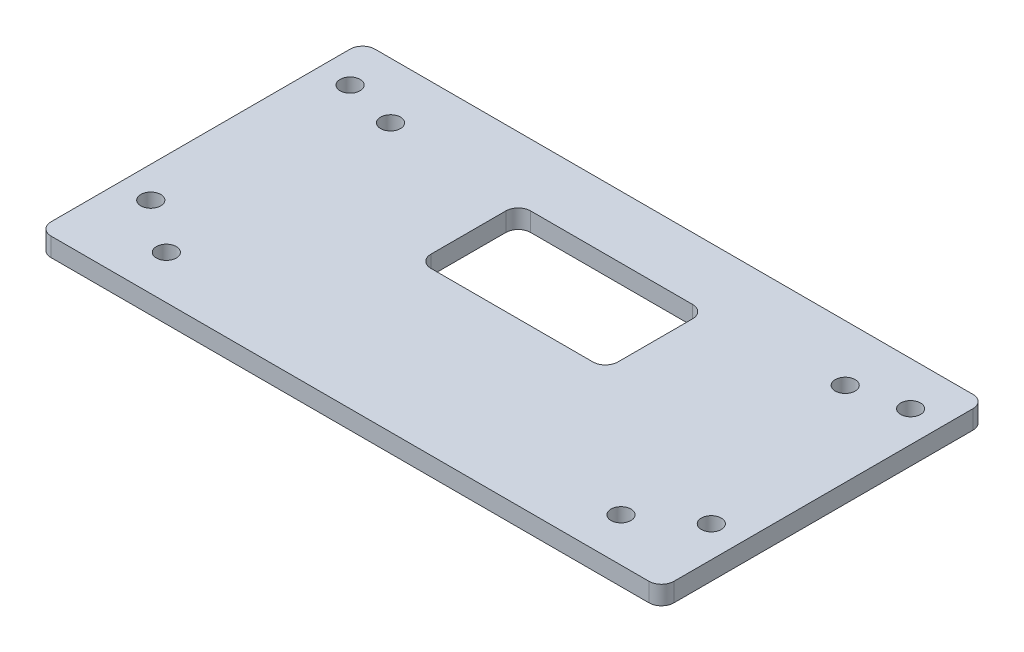
ISO-10303-21;
HEADER;
FILE_DESCRIPTION(('STEP AP214'),'2;1');
FILE_NAME('part.step','',(''),(''),'','','');
FILE_SCHEMA(('AUTOMOTIVE_DESIGN { 1 0 10303 214 1 1 1 1 }'));
ENDSEC;
DATA;
#1=APPLICATION_CONTEXT('core data for automotive mechanical design processes');
#2=APPLICATION_PROTOCOL_DEFINITION('international standard','automotive_design',2000,#1);
#3=PRODUCT_CONTEXT('',#1,'mechanical');
#4=PRODUCT('Part','Part','',(#3));
#5=PRODUCT_RELATED_PRODUCT_CATEGORY('part','',(#4));
#6=PRODUCT_DEFINITION_FORMATION('','',#4);
#7=PRODUCT_DEFINITION_CONTEXT('part definition',#1,'design');
#8=PRODUCT_DEFINITION('design','',#6,#7);
#9=PRODUCT_DEFINITION_SHAPE('','',#8);
#10=(LENGTH_UNIT() NAMED_UNIT(*) SI_UNIT(.MILLI.,.METRE.));
#11=(NAMED_UNIT(*) PLANE_ANGLE_UNIT() SI_UNIT($,.RADIAN.));
#12=(NAMED_UNIT(*) SI_UNIT($,.STERADIAN.) SOLID_ANGLE_UNIT());
#13=UNCERTAINTY_MEASURE_WITH_UNIT(LENGTH_MEASURE(1.E-05),#10,'distance_accuracy_value','');
#14=(GEOMETRIC_REPRESENTATION_CONTEXT(3) GLOBAL_UNCERTAINTY_ASSIGNED_CONTEXT((#13)) GLOBAL_UNIT_ASSIGNED_CONTEXT((#10,
#11,#12)) REPRESENTATION_CONTEXT('',''));
#15=CARTESIAN_POINT('',(0.,0.,0.));
#16=DIRECTION('',(0.,0.,1.));
#17=DIRECTION('',(1.,0.,0.));
#18=AXIS2_PLACEMENT_3D('',#15,#16,#17);
#19=CARTESIAN_POINT('',(0.,3.,0.));
#20=DIRECTION('',(0.,-1.,0.));
#21=DIRECTION('',(0.,0.,-1.));
#22=AXIS2_PLACEMENT_3D('',#19,#20,#21);
#23=PLANE('',#22);
#24=CARTESIAN_POINT('',(45.,3.,-19.));
#25=DIRECTION('',(0.,1.,0.));
#26=DIRECTION('',(0.,0.,-1.));
#27=AXIS2_PLACEMENT_3D('',#24,#25,#26);
#28=CIRCLE('',#27,1.6);
#29=CARTESIAN_POINT('',(45.,3.,-20.6));
#30=VERTEX_POINT('',#29);
#31=EDGE_CURVE('E222',#30,#30,#28,.T.);
#32=ORIENTED_EDGE('',*,*,#31,.F.);
#33=EDGE_LOOP('',(#32));
#34=FACE_BOUND('',#33,.T.);
#35=CARTESIAN_POINT('',(-44.9999999999997,3.,13.));
#36=DIRECTION('',(0.,1.,0.));
#37=DIRECTION('',(0.,0.,1.));
#38=AXIS2_PLACEMENT_3D('',#35,#36,#37);
#39=CIRCLE('',#38,1.6);
#40=CARTESIAN_POINT('',(-44.9999999999997,3.,14.6));
#41=VERTEX_POINT('',#40);
#42=EDGE_CURVE('E228',#41,#41,#39,.T.);
#43=ORIENTED_EDGE('',*,*,#42,.F.);
#44=EDGE_LOOP('',(#43));
#45=FACE_BOUND('',#44,.T.);
#46=CARTESIAN_POINT('',(-36.4999999999991,3.,19.));
#47=DIRECTION('',(0.,1.,0.));
#48=DIRECTION('',(0.,0.,1.));
#49=AXIS2_PLACEMENT_3D('',#46,#47,#48);
#50=CIRCLE('',#49,1.6);
#51=CARTESIAN_POINT('',(-36.4999999999991,3.,20.6));
#52=VERTEX_POINT('',#51);
#53=EDGE_CURVE('E234',#52,#52,#50,.T.);
#54=ORIENTED_EDGE('',*,*,#53,.F.);
#55=EDGE_LOOP('',(#54));
#56=FACE_BOUND('',#55,.T.);
#57=CARTESIAN_POINT('',(36.5000000000009,3.,19.));
#58=DIRECTION('',(0.,1.,0.));
#59=DIRECTION('',(0.,0.,1.));
#60=AXIS2_PLACEMENT_3D('',#57,#58,#59);
#61=CIRCLE('',#60,1.6);
#62=CARTESIAN_POINT('',(36.5000000000009,3.,20.6));
#63=VERTEX_POINT('',#62);
#64=EDGE_CURVE('E240',#63,#63,#61,.T.);
#65=ORIENTED_EDGE('',*,*,#64,.F.);
#66=EDGE_LOOP('',(#65));
#67=FACE_BOUND('',#66,.T.);
#68=CARTESIAN_POINT('',(36.5,3.,-17.));
#69=DIRECTION('',(0.,1.,0.));
#70=DIRECTION('',(0.,0.,1.));
#71=AXIS2_PLACEMENT_3D('',#68,#69,#70);
#72=CIRCLE('',#71,1.6);
#73=CARTESIAN_POINT('',(36.5,3.,-15.4));
#74=VERTEX_POINT('',#73);
#75=EDGE_CURVE('E246',#74,#74,#72,.T.);
#76=ORIENTED_EDGE('',*,*,#75,.F.);
#77=EDGE_LOOP('',(#76));
#78=FACE_BOUND('',#77,.T.);
#79=CARTESIAN_POINT('',(-45.,3.,-19.));
#80=DIRECTION('',(0.,1.,0.));
#81=DIRECTION('',(0.,0.,1.));
#82=AXIS2_PLACEMENT_3D('',#79,#80,#81);
#83=CIRCLE('',#82,1.6);
#84=CARTESIAN_POINT('',(-45.,3.,-17.4));
#85=VERTEX_POINT('',#84);
#86=EDGE_CURVE('E252',#85,#85,#83,.T.);
#87=ORIENTED_EDGE('',*,*,#86,.F.);
#88=EDGE_LOOP('',(#87));
#89=FACE_BOUND('',#88,.T.);
#90=CARTESIAN_POINT('',(-36.5,3.,-17.));
#91=DIRECTION('',(0.,1.,0.));
#92=DIRECTION('',(0.,0.,1.));
#93=AXIS2_PLACEMENT_3D('',#90,#91,#92);
#94=CIRCLE('',#93,1.6);
#95=CARTESIAN_POINT('',(-36.5,3.,-15.4));
#96=VERTEX_POINT('',#95);
#97=EDGE_CURVE('E258',#96,#96,#94,.T.);
#98=ORIENTED_EDGE('',*,*,#97,.F.);
#99=EDGE_LOOP('',(#98));
#100=FACE_BOUND('',#99,.T.);
#101=DIRECTION('',(0.,0.,-1.));
#102=VECTOR('',#101,1.);
#103=CARTESIAN_POINT('',(50.,3.,26.));
#104=LINE('',#103,#102);
#105=CARTESIAN_POINT('',(50.,3.,24.));
#106=VERTEX_POINT('',#105);
#107=CARTESIAN_POINT('',(50.,3.,-24.));
#108=VERTEX_POINT('',#107);
#109=EDGE_CURVE('E264',#106,#108,#104,.T.);
#110=ORIENTED_EDGE('',*,*,#109,.T.);
#111=CARTESIAN_POINT('',(48.,3.,-24.));
#112=DIRECTION('',(0.,-1.,0.));
#113=DIRECTION('',(0.,0.,-1.));
#114=AXIS2_PLACEMENT_3D('',#111,#112,#113);
#115=CIRCLE('',#114,2.);
#116=CARTESIAN_POINT('',(48.,3.,-26.));
#117=VERTEX_POINT('',#116);
#118=EDGE_CURVE('E307',#108,#117,#115,.F.);
#119=ORIENTED_EDGE('',*,*,#118,.T.);
#120=DIRECTION('',(-1.,0.,0.));
#121=VECTOR('',#120,1.);
#122=CARTESIAN_POINT('',(-50.,3.,-26.));
#123=LINE('',#122,#121);
#124=CARTESIAN_POINT('',(-48.,3.,-26.));
#125=VERTEX_POINT('',#124);
#126=EDGE_CURVE('E267',#117,#125,#123,.T.);
#127=ORIENTED_EDGE('',*,*,#126,.T.);
#128=CARTESIAN_POINT('',(-48.,3.,-24.));
#129=DIRECTION('',(0.,-1.,0.));
#130=DIRECTION('',(0.,0.,-1.));
#131=AXIS2_PLACEMENT_3D('',#128,#129,#130);
#132=CIRCLE('',#131,2.);
#133=CARTESIAN_POINT('',(-50.,3.,-24.));
#134=VERTEX_POINT('',#133);
#135=EDGE_CURVE('E302',#125,#134,#132,.F.);
#136=ORIENTED_EDGE('',*,*,#135,.T.);
#137=DIRECTION('',(0.,0.,1.));
#138=VECTOR('',#137,1.);
#139=CARTESIAN_POINT('',(-50.,3.,26.));
#140=LINE('',#139,#138);
#141=CARTESIAN_POINT('',(-50.,3.,24.));
#142=VERTEX_POINT('',#141);
#143=EDGE_CURVE('E271',#134,#142,#140,.T.);
#144=ORIENTED_EDGE('',*,*,#143,.T.);
#145=CARTESIAN_POINT('',(-48.,3.,24.));
#146=DIRECTION('',(0.,-1.,0.));
#147=DIRECTION('',(0.,0.,-1.));
#148=AXIS2_PLACEMENT_3D('',#145,#146,#147);
#149=CIRCLE('',#148,2.);
#150=CARTESIAN_POINT('',(-48.,3.,26.));
#151=VERTEX_POINT('',#150);
#152=EDGE_CURVE('E56',#142,#151,#149,.F.);
#153=ORIENTED_EDGE('',*,*,#152,.T.);
#154=DIRECTION('',(1.,0.,0.));
#155=VECTOR('',#154,1.);
#156=CARTESIAN_POINT('',(-50.,3.,26.));
#157=LINE('',#156,#155);
#158=CARTESIAN_POINT('',(48.,3.,26.));
#159=VERTEX_POINT('',#158);
#160=EDGE_CURVE('E273',#151,#159,#157,.T.);
#161=ORIENTED_EDGE('',*,*,#160,.T.);
#162=CARTESIAN_POINT('',(48.,3.,24.));
#163=DIRECTION('',(0.,-1.,0.));
#164=DIRECTION('',(0.,0.,-1.));
#165=AXIS2_PLACEMENT_3D('',#162,#163,#164);
#166=CIRCLE('',#165,2.);
#167=EDGE_CURVE('E305',#159,#106,#166,.F.);
#168=ORIENTED_EDGE('',*,*,#167,.T.);
#169=EDGE_LOOP('',(#110,#119,#127,#136,#144,#153,#161,#168));
#170=FACE_BOUND('',#169,.T.);
#171=CARTESIAN_POINT('',(13.,3.,-2.));
#172=DIRECTION('',(0.,1.,0.));
#173=DIRECTION('',(0.,0.,1.));
#174=AXIS2_PLACEMENT_3D('',#171,#172,#173);
#175=CIRCLE('',#174,2.);
#176=CARTESIAN_POINT('',(13.,3.,0.));
#177=VERTEX_POINT('',#176);
#178=CARTESIAN_POINT('',(15.,3.,-2.));
#179=VERTEX_POINT('',#178);
#180=EDGE_CURVE('E149',#177,#179,#175,.T.);
#181=ORIENTED_EDGE('',*,*,#180,.F.);
#182=DIRECTION('',(1.,0.,0.));
#183=VECTOR('',#182,1.);
#184=CARTESIAN_POINT('',(-13.,3.,0.));
#185=LINE('',#184,#183);
#186=CARTESIAN_POINT('',(-13.,3.,0.));
#187=VERTEX_POINT('',#186);
#188=EDGE_CURVE('E187',#187,#177,#185,.T.);
#189=ORIENTED_EDGE('',*,*,#188,.F.);
#190=CARTESIAN_POINT('',(-13.,3.,-2.));
#191=DIRECTION('',(0.,1.,0.));
#192=DIRECTION('',(0.,0.,-1.));
#193=AXIS2_PLACEMENT_3D('',#190,#191,#192);
#194=CIRCLE('',#193,2.);
#195=CARTESIAN_POINT('',(-15.,3.,-2.));
#196=VERTEX_POINT('',#195);
#197=EDGE_CURVE('E184',#196,#187,#194,.T.);
#198=ORIENTED_EDGE('',*,*,#197,.F.);
#199=DIRECTION('',(0.,0.,1.));
#200=VECTOR('',#199,1.);
#201=CARTESIAN_POINT('',(-15.,3.,-2.));
#202=LINE('',#201,#200);
#203=CARTESIAN_POINT('',(-15.,3.,-14.));
#204=VERTEX_POINT('',#203);
#205=EDGE_CURVE('E182',#204,#196,#202,.T.);
#206=ORIENTED_EDGE('',*,*,#205,.F.);
#207=CARTESIAN_POINT('',(-13.,3.,-14.));
#208=DIRECTION('',(0.,1.,0.));
#209=DIRECTION('',(0.,0.,-1.));
#210=AXIS2_PLACEMENT_3D('',#207,#208,#209);
#211=CIRCLE('',#210,2.);
#212=CARTESIAN_POINT('',(-13.,3.,-16.));
#213=VERTEX_POINT('',#212);
#214=EDGE_CURVE('E180',#213,#204,#211,.T.);
#215=ORIENTED_EDGE('',*,*,#214,.F.);
#216=DIRECTION('',(-1.,0.,0.));
#217=VECTOR('',#216,1.);
#218=CARTESIAN_POINT('',(-13.,3.,-16.));
#219=LINE('',#218,#217);
#220=CARTESIAN_POINT('',(13.,3.,-16.));
#221=VERTEX_POINT('',#220);
#222=EDGE_CURVE('E175',#221,#213,#219,.T.);
#223=ORIENTED_EDGE('',*,*,#222,.F.);
#224=CARTESIAN_POINT('',(13.,3.,-14.));
#225=DIRECTION('',(0.,1.,0.));
#226=DIRECTION('',(0.,0.,-1.));
#227=AXIS2_PLACEMENT_3D('',#224,#225,#226);
#228=CIRCLE('',#227,2.);
#229=CARTESIAN_POINT('',(15.,3.,-14.));
#230=VERTEX_POINT('',#229);
#231=EDGE_CURVE('E173',#230,#221,#228,.T.);
#232=ORIENTED_EDGE('',*,*,#231,.F.);
#233=DIRECTION('',(0.,0.,-1.));
#234=VECTOR('',#233,1.);
#235=CARTESIAN_POINT('',(15.,3.,-2.));
#236=LINE('',#235,#234);
#237=EDGE_CURVE('E159',#179,#230,#236,.T.);
#238=ORIENTED_EDGE('',*,*,#237,.F.);
#239=EDGE_LOOP('',(#181,#189,#198,#206,#215,#223,#232,#238));
#240=FACE_BOUND('',#239,.T.);
#241=CARTESIAN_POINT('',(45.0000000000003,3.,13.));
#242=DIRECTION('',(0.,1.,0.));
#243=DIRECTION('',(0.,0.,-1.));
#244=AXIS2_PLACEMENT_3D('',#241,#242,#243);
#245=CIRCLE('',#244,1.6);
#246=CARTESIAN_POINT('',(45.0000000000003,3.,11.4));
#247=VERTEX_POINT('',#246);
#248=EDGE_CURVE('E191',#247,#247,#245,.T.);
#249=ORIENTED_EDGE('',*,*,#248,.F.);
#250=EDGE_LOOP('',(#249));
#251=FACE_BOUND('',#250,.T.);
#252=ADVANCED_FACE('F34',(#34,#45,#56,#67,#78,#89,#100,#170,#240,#251),#23,.F.);
#253=CARTESIAN_POINT('',(0.,0.,0.));
#254=DIRECTION('',(0.,-1.,0.));
#255=DIRECTION('',(0.,0.,-1.));
#256=AXIS2_PLACEMENT_3D('',#253,#254,#255);
#257=PLANE('',#256);
#258=DIRECTION('',(1.,0.,0.));
#259=VECTOR('',#258,1.);
#260=CARTESIAN_POINT('',(-13.,0.,0.));
#261=LINE('',#260,#259);
#262=CARTESIAN_POINT('',(-13.,0.,0.));
#263=VERTEX_POINT('',#262);
#264=CARTESIAN_POINT('',(13.,0.,0.));
#265=VERTEX_POINT('',#264);
#266=EDGE_CURVE('E160',#263,#265,#261,.T.);
#267=ORIENTED_EDGE('',*,*,#266,.T.);
#268=CARTESIAN_POINT('',(13.,0.,-2.));
#269=DIRECTION('',(0.,1.,0.));
#270=DIRECTION('',(0.,0.,1.));
#271=AXIS2_PLACEMENT_3D('',#268,#269,#270);
#272=CIRCLE('',#271,2.);
#273=CARTESIAN_POINT('',(15.,0.,-2.));
#274=VERTEX_POINT('',#273);
#275=EDGE_CURVE('E189',#265,#274,#272,.T.);
#276=ORIENTED_EDGE('',*,*,#275,.T.);
#277=DIRECTION('',(0.,0.,-1.));
#278=VECTOR('',#277,1.);
#279=CARTESIAN_POINT('',(15.,0.,-2.));
#280=LINE('',#279,#278);
#281=CARTESIAN_POINT('',(15.,0.,-14.));
#282=VERTEX_POINT('',#281);
#283=EDGE_CURVE('E166',#274,#282,#280,.T.);
#284=ORIENTED_EDGE('',*,*,#283,.T.);
#285=CARTESIAN_POINT('',(13.,0.,-14.));
#286=DIRECTION('',(0.,1.,0.));
#287=DIRECTION('',(0.,0.,-1.));
#288=AXIS2_PLACEMENT_3D('',#285,#286,#287);
#289=CIRCLE('',#288,2.);
#290=CARTESIAN_POINT('',(13.,0.,-16.));
#291=VERTEX_POINT('',#290);
#292=EDGE_CURVE('E193',#282,#291,#289,.T.);
#293=ORIENTED_EDGE('',*,*,#292,.T.);
#294=DIRECTION('',(-1.,0.,0.));
#295=VECTOR('',#294,1.);
#296=CARTESIAN_POINT('',(-13.,0.,-16.));
#297=LINE('',#296,#295);
#298=CARTESIAN_POINT('',(-13.,0.,-16.));
#299=VERTEX_POINT('',#298);
#300=EDGE_CURVE('E196',#291,#299,#297,.T.);
#301=ORIENTED_EDGE('',*,*,#300,.T.);
#302=CARTESIAN_POINT('',(-13.,0.,-14.));
#303=DIRECTION('',(0.,1.,0.));
#304=DIRECTION('',(0.,0.,-1.));
#305=AXIS2_PLACEMENT_3D('',#302,#303,#304);
#306=CIRCLE('',#305,2.);
#307=CARTESIAN_POINT('',(-15.,0.,-14.));
#308=VERTEX_POINT('',#307);
#309=EDGE_CURVE('E199',#299,#308,#306,.T.);
#310=ORIENTED_EDGE('',*,*,#309,.T.);
#311=DIRECTION('',(0.,0.,1.));
#312=VECTOR('',#311,1.);
#313=CARTESIAN_POINT('',(-15.,0.,-2.));
#314=LINE('',#313,#312);
#315=CARTESIAN_POINT('',(-15.,0.,-2.));
#316=VERTEX_POINT('',#315);
#317=EDGE_CURVE('E202',#308,#316,#314,.T.);
#318=ORIENTED_EDGE('',*,*,#317,.T.);
#319=CARTESIAN_POINT('',(-13.,0.,-2.));
#320=DIRECTION('',(0.,1.,0.));
#321=DIRECTION('',(0.,0.,-1.));
#322=AXIS2_PLACEMENT_3D('',#319,#320,#321);
#323=CIRCLE('',#322,2.);
#324=EDGE_CURVE('E205',#316,#263,#323,.T.);
#325=ORIENTED_EDGE('',*,*,#324,.T.);
#326=EDGE_LOOP('',(#267,#276,#284,#293,#301,#310,#318,#325));
#327=FACE_BOUND('',#326,.T.);
#328=CARTESIAN_POINT('',(45.,0.,-19.));
#329=DIRECTION('',(0.,1.,0.));
#330=DIRECTION('',(0.,0.,-1.));
#331=AXIS2_PLACEMENT_3D('',#328,#329,#330);
#332=CIRCLE('',#331,1.6);
#333=CARTESIAN_POINT('',(45.,0.,-20.6));
#334=VERTEX_POINT('',#333);
#335=EDGE_CURVE('E167',#334,#334,#332,.T.);
#336=ORIENTED_EDGE('',*,*,#335,.T.);
#337=EDGE_LOOP('',(#336));
#338=FACE_BOUND('',#337,.T.);
#339=CARTESIAN_POINT('',(-36.4999999999991,0.,19.));
#340=DIRECTION('',(0.,1.,0.));
#341=DIRECTION('',(0.,0.,1.));
#342=AXIS2_PLACEMENT_3D('',#339,#340,#341);
#343=CIRCLE('',#342,1.6);
#344=CARTESIAN_POINT('',(-36.4999999999991,0.,20.6));
#345=VERTEX_POINT('',#344);
#346=EDGE_CURVE('E231',#345,#345,#343,.T.);
#347=ORIENTED_EDGE('',*,*,#346,.T.);
#348=EDGE_LOOP('',(#347));
#349=FACE_BOUND('',#348,.T.);
#350=CARTESIAN_POINT('',(36.5,0.,-17.));
#351=DIRECTION('',(0.,1.,0.));
#352=DIRECTION('',(0.,0.,1.));
#353=AXIS2_PLACEMENT_3D('',#350,#351,#352);
#354=CIRCLE('',#353,1.6);
#355=CARTESIAN_POINT('',(36.5,0.,-15.4));
#356=VERTEX_POINT('',#355);
#357=EDGE_CURVE('E243',#356,#356,#354,.T.);
#358=ORIENTED_EDGE('',*,*,#357,.T.);
#359=EDGE_LOOP('',(#358));
#360=FACE_BOUND('',#359,.T.);
#361=CARTESIAN_POINT('',(-36.5,0.,-17.));
#362=DIRECTION('',(0.,1.,0.));
#363=DIRECTION('',(0.,0.,1.));
#364=AXIS2_PLACEMENT_3D('',#361,#362,#363);
#365=CIRCLE('',#364,1.6);
#366=CARTESIAN_POINT('',(-36.5,0.,-15.4));
#367=VERTEX_POINT('',#366);
#368=EDGE_CURVE('E255',#367,#367,#365,.T.);
#369=ORIENTED_EDGE('',*,*,#368,.T.);
#370=EDGE_LOOP('',(#369));
#371=FACE_BOUND('',#370,.T.);
#372=DIRECTION('',(-1.,0.,0.));
#373=VECTOR('',#372,1.);
#374=CARTESIAN_POINT('',(-50.,0.,-26.));
#375=LINE('',#374,#373);
#376=CARTESIAN_POINT('',(48.,0.,-26.));
#377=VERTEX_POINT('',#376);
#378=CARTESIAN_POINT('',(-48.,0.,-26.));
#379=VERTEX_POINT('',#378);
#380=EDGE_CURVE('E278',#377,#379,#375,.T.);
#381=ORIENTED_EDGE('',*,*,#380,.F.);
#382=CARTESIAN_POINT('',(48.,0.,-24.));
#383=DIRECTION('',(0.,-1.,0.));
#384=DIRECTION('',(0.,0.,-1.));
#385=AXIS2_PLACEMENT_3D('',#382,#383,#384);
#386=CIRCLE('',#385,2.);
#387=CARTESIAN_POINT('',(50.,0.,-24.));
#388=VERTEX_POINT('',#387);
#389=EDGE_CURVE('E295',#377,#388,#386,.T.);
#390=ORIENTED_EDGE('',*,*,#389,.T.);
#391=DIRECTION('',(0.,0.,-1.));
#392=VECTOR('',#391,1.);
#393=CARTESIAN_POINT('',(50.,0.,26.));
#394=LINE('',#393,#392);
#395=CARTESIAN_POINT('',(50.,0.,24.));
#396=VERTEX_POINT('',#395);
#397=EDGE_CURVE('E261',#396,#388,#394,.T.);
#398=ORIENTED_EDGE('',*,*,#397,.F.);
#399=CARTESIAN_POINT('',(48.,0.,24.));
#400=DIRECTION('',(0.,-1.,0.));
#401=DIRECTION('',(0.,0.,-1.));
#402=AXIS2_PLACEMENT_3D('',#399,#400,#401);
#403=CIRCLE('',#402,2.);
#404=CARTESIAN_POINT('',(48.,0.,26.));
#405=VERTEX_POINT('',#404);
#406=EDGE_CURVE('E293',#396,#405,#403,.T.);
#407=ORIENTED_EDGE('',*,*,#406,.T.);
#408=DIRECTION('',(1.,0.,0.));
#409=VECTOR('',#408,1.);
#410=CARTESIAN_POINT('',(-50.,0.,26.));
#411=LINE('',#410,#409);
#412=CARTESIAN_POINT('',(-48.,0.,26.));
#413=VERTEX_POINT('',#412);
#414=EDGE_CURVE('E268',#413,#405,#411,.T.);
#415=ORIENTED_EDGE('',*,*,#414,.F.);
#416=CARTESIAN_POINT('',(-48.,0.,24.));
#417=DIRECTION('',(0.,-1.,0.));
#418=DIRECTION('',(0.,0.,-1.));
#419=AXIS2_PLACEMENT_3D('',#416,#417,#418);
#420=CIRCLE('',#419,2.);
#421=CARTESIAN_POINT('',(-50.,0.,24.));
#422=VERTEX_POINT('',#421);
#423=EDGE_CURVE('E291',#413,#422,#420,.T.);
#424=ORIENTED_EDGE('',*,*,#423,.T.);
#425=DIRECTION('',(0.,0.,1.));
#426=VECTOR('',#425,1.);
#427=CARTESIAN_POINT('',(-50.,0.,26.));
#428=LINE('',#427,#426);
#429=CARTESIAN_POINT('',(-50.,0.,-24.));
#430=VERTEX_POINT('',#429);
#431=EDGE_CURVE('E281',#430,#422,#428,.T.);
#432=ORIENTED_EDGE('',*,*,#431,.F.);
#433=CARTESIAN_POINT('',(-48.,0.,-24.));
#434=DIRECTION('',(0.,-1.,0.));
#435=DIRECTION('',(0.,0.,-1.));
#436=AXIS2_PLACEMENT_3D('',#433,#434,#435);
#437=CIRCLE('',#436,2.);
#438=EDGE_CURVE('E289',#430,#379,#437,.T.);
#439=ORIENTED_EDGE('',*,*,#438,.T.);
#440=EDGE_LOOP('',(#381,#390,#398,#407,#415,#424,#432,#439));
#441=FACE_BOUND('',#440,.T.);
#442=CARTESIAN_POINT('',(-45.,0.,-19.));
#443=DIRECTION('',(0.,1.,0.));
#444=DIRECTION('',(0.,0.,1.));
#445=AXIS2_PLACEMENT_3D('',#442,#443,#444);
#446=CIRCLE('',#445,1.6);
#447=CARTESIAN_POINT('',(-45.,0.,-17.4));
#448=VERTEX_POINT('',#447);
#449=EDGE_CURVE('E249',#448,#448,#446,.T.);
#450=ORIENTED_EDGE('',*,*,#449,.T.);
#451=EDGE_LOOP('',(#450));
#452=FACE_BOUND('',#451,.T.);
#453=CARTESIAN_POINT('',(36.5000000000009,0.,19.));
#454=DIRECTION('',(0.,1.,0.));
#455=DIRECTION('',(0.,0.,1.));
#456=AXIS2_PLACEMENT_3D('',#453,#454,#455);
#457=CIRCLE('',#456,1.6);
#458=CARTESIAN_POINT('',(36.5000000000009,0.,20.6));
#459=VERTEX_POINT('',#458);
#460=EDGE_CURVE('E237',#459,#459,#457,.T.);
#461=ORIENTED_EDGE('',*,*,#460,.T.);
#462=EDGE_LOOP('',(#461));
#463=FACE_BOUND('',#462,.T.);
#464=CARTESIAN_POINT('',(-44.9999999999997,0.,13.));
#465=DIRECTION('',(0.,1.,0.));
#466=DIRECTION('',(0.,0.,1.));
#467=AXIS2_PLACEMENT_3D('',#464,#465,#466);
#468=CIRCLE('',#467,1.6);
#469=CARTESIAN_POINT('',(-44.9999999999997,0.,14.6));
#470=VERTEX_POINT('',#469);
#471=EDGE_CURVE('E225',#470,#470,#468,.T.);
#472=ORIENTED_EDGE('',*,*,#471,.T.);
#473=EDGE_LOOP('',(#472));
#474=FACE_BOUND('',#473,.T.);
#475=CARTESIAN_POINT('',(45.0000000000003,0.,13.));
#476=DIRECTION('',(0.,1.,0.));
#477=DIRECTION('',(0.,0.,-1.));
#478=AXIS2_PLACEMENT_3D('',#475,#476,#477);
#479=CIRCLE('',#478,1.6);
#480=CARTESIAN_POINT('',(45.0000000000003,0.,11.4));
#481=VERTEX_POINT('',#480);
#482=EDGE_CURVE('E600',#481,#481,#479,.T.);
#483=ORIENTED_EDGE('',*,*,#482,.T.);
#484=EDGE_LOOP('',(#483));
#485=FACE_BOUND('',#484,.T.);
#486=ADVANCED_FACE('F323',(#327,#338,#349,#360,#371,#441,#452,#463,#474,#485),#257,.T.);
#487=CARTESIAN_POINT('',(50.,3.,26.));
#488=DIRECTION('',(-1.,0.,0.));
#489=DIRECTION('',(0.,0.,1.));
#490=AXIS2_PLACEMENT_3D('',#487,#488,#489);
#491=PLANE('',#490);
#492=ORIENTED_EDGE('',*,*,#397,.T.);
#493=DIRECTION('',(0.,-1.,0.));
#494=VECTOR('',#493,1.);
#495=CARTESIAN_POINT('',(50.,3.,-24.));
#496=LINE('',#495,#494);
#497=EDGE_CURVE('E300',#388,#108,#496,.F.);
#498=ORIENTED_EDGE('',*,*,#497,.T.);
#499=ORIENTED_EDGE('',*,*,#109,.F.);
#500=DIRECTION('',(0.,-1.,0.));
#501=VECTOR('',#500,1.);
#502=CARTESIAN_POINT('',(50.,3.,24.));
#503=LINE('',#502,#501);
#504=EDGE_CURVE('E297',#106,#396,#503,.T.);
#505=ORIENTED_EDGE('',*,*,#504,.T.);
#506=EDGE_LOOP('',(#492,#498,#499,#505));
#507=FACE_BOUND('',#506,.T.);
#508=ADVANCED_FACE('F337',(#507),#491,.F.);
#509=CARTESIAN_POINT('',(-50.,3.,-26.));
#510=DIRECTION('',(0.,0.,1.));
#511=DIRECTION('',(1.,0.,0.));
#512=AXIS2_PLACEMENT_3D('',#509,#510,#511);
#513=PLANE('',#512);
#514=ORIENTED_EDGE('',*,*,#126,.F.);
#515=DIRECTION('',(0.,-1.,0.));
#516=VECTOR('',#515,1.);
#517=CARTESIAN_POINT('',(48.,3.,-26.));
#518=LINE('',#517,#516);
#519=EDGE_CURVE('E286',#117,#377,#518,.T.);
#520=ORIENTED_EDGE('',*,*,#519,.T.);
#521=ORIENTED_EDGE('',*,*,#380,.T.);
#522=DIRECTION('',(0.,-1.,0.));
#523=VECTOR('',#522,1.);
#524=CARTESIAN_POINT('',(-48.,3.,-26.));
#525=LINE('',#524,#523);
#526=EDGE_CURVE('E275',#379,#125,#525,.F.);
#527=ORIENTED_EDGE('',*,*,#526,.T.);
#528=EDGE_LOOP('',(#514,#520,#521,#527));
#529=FACE_BOUND('',#528,.T.);
#530=ADVANCED_FACE('F345',(#529),#513,.F.);
#531=CARTESIAN_POINT('',(-50.,3.,26.));
#532=DIRECTION('',(1.,0.,0.));
#533=DIRECTION('',(0.,0.,-1.));
#534=AXIS2_PLACEMENT_3D('',#531,#532,#533);
#535=PLANE('',#534);
#536=ORIENTED_EDGE('',*,*,#431,.T.);
#537=DIRECTION('',(0.,-1.,0.));
#538=VECTOR('',#537,1.);
#539=CARTESIAN_POINT('',(-50.,3.,24.));
#540=LINE('',#539,#538);
#541=EDGE_CURVE('E11',#422,#142,#540,.F.);
#542=ORIENTED_EDGE('',*,*,#541,.T.);
#543=ORIENTED_EDGE('',*,*,#143,.F.);
#544=DIRECTION('',(0.,-1.,0.));
#545=VECTOR('',#544,1.);
#546=CARTESIAN_POINT('',(-50.,3.,-24.));
#547=LINE('',#546,#545);
#548=EDGE_CURVE('E42',#134,#430,#547,.T.);
#549=ORIENTED_EDGE('',*,*,#548,.T.);
#550=EDGE_LOOP('',(#536,#542,#543,#549));
#551=FACE_BOUND('',#550,.T.);
#552=ADVANCED_FACE('F317',(#551),#535,.F.);
#553=CARTESIAN_POINT('',(-50.,3.,26.));
#554=DIRECTION('',(0.,0.,-1.));
#555=DIRECTION('',(-1.,0.,0.));
#556=AXIS2_PLACEMENT_3D('',#553,#554,#555);
#557=PLANE('',#556);
#558=ORIENTED_EDGE('',*,*,#414,.T.);
#559=DIRECTION('',(0.,-1.,0.));
#560=VECTOR('',#559,1.);
#561=CARTESIAN_POINT('',(48.,3.,26.));
#562=LINE('',#561,#560);
#563=EDGE_CURVE('E49',#405,#159,#562,.F.);
#564=ORIENTED_EDGE('',*,*,#563,.T.);
#565=ORIENTED_EDGE('',*,*,#160,.F.);
#566=DIRECTION('',(0.,-1.,0.));
#567=VECTOR('',#566,1.);
#568=CARTESIAN_POINT('',(-48.,3.,26.));
#569=LINE('',#568,#567);
#570=EDGE_CURVE('E309',#151,#413,#569,.T.);
#571=ORIENTED_EDGE('',*,*,#570,.T.);
#572=EDGE_LOOP('',(#558,#564,#565,#571));
#573=FACE_BOUND('',#572,.T.);
#574=ADVANCED_FACE('F329',(#573),#557,.F.);
#575=CARTESIAN_POINT('',(-36.5,3.,-17.));
#576=DIRECTION('',(0.,-1.,0.));
#577=DIRECTION('',(0.,0.,-1.));
#578=AXIS2_PLACEMENT_3D('',#575,#576,#577);
#579=CYLINDRICAL_SURFACE('',#578,1.6);
#580=ORIENTED_EDGE('',*,*,#97,.T.);
#581=EDGE_LOOP('',(#580));
#582=FACE_BOUND('',#581,.T.);
#583=ORIENTED_EDGE('',*,*,#368,.F.);
#584=EDGE_LOOP('',(#583));
#585=FACE_BOUND('',#584,.T.);
#586=ADVANCED_FACE('F362',(#582,#585),#579,.F.);
#587=CARTESIAN_POINT('',(-45.,3.,-19.));
#588=DIRECTION('',(0.,-1.,0.));
#589=DIRECTION('',(0.,0.,-1.));
#590=AXIS2_PLACEMENT_3D('',#587,#588,#589);
#591=CYLINDRICAL_SURFACE('',#590,1.6);
#592=ORIENTED_EDGE('',*,*,#86,.T.);
#593=EDGE_LOOP('',(#592));
#594=FACE_BOUND('',#593,.T.);
#595=ORIENTED_EDGE('',*,*,#449,.F.);
#596=EDGE_LOOP('',(#595));
#597=FACE_BOUND('',#596,.T.);
#598=ADVANCED_FACE('F519',(#594,#597),#591,.F.);
#599=CARTESIAN_POINT('',(36.5,3.,-17.));
#600=DIRECTION('',(0.,-1.,0.));
#601=DIRECTION('',(0.,0.,-1.));
#602=AXIS2_PLACEMENT_3D('',#599,#600,#601);
#603=CYLINDRICAL_SURFACE('',#602,1.6);
#604=ORIENTED_EDGE('',*,*,#75,.T.);
#605=EDGE_LOOP('',(#604));
#606=FACE_BOUND('',#605,.T.);
#607=ORIENTED_EDGE('',*,*,#357,.F.);
#608=EDGE_LOOP('',(#607));
#609=FACE_BOUND('',#608,.T.);
#610=ADVANCED_FACE('F510',(#606,#609),#603,.F.);
#611=CARTESIAN_POINT('',(36.5000000000009,3.,19.));
#612=DIRECTION('',(0.,-1.,0.));
#613=DIRECTION('',(0.,0.,-1.));
#614=AXIS2_PLACEMENT_3D('',#611,#612,#613);
#615=CYLINDRICAL_SURFACE('',#614,1.6);
#616=ORIENTED_EDGE('',*,*,#64,.T.);
#617=EDGE_LOOP('',(#616));
#618=FACE_BOUND('',#617,.T.);
#619=ORIENTED_EDGE('',*,*,#460,.F.);
#620=EDGE_LOOP('',(#619));
#621=FACE_BOUND('',#620,.T.);
#622=ADVANCED_FACE('F501',(#618,#621),#615,.F.);
#623=CARTESIAN_POINT('',(-36.4999999999991,3.,19.));
#624=DIRECTION('',(0.,-1.,0.));
#625=DIRECTION('',(0.,0.,-1.));
#626=AXIS2_PLACEMENT_3D('',#623,#624,#625);
#627=CYLINDRICAL_SURFACE('',#626,1.6);
#628=ORIENTED_EDGE('',*,*,#53,.T.);
#629=EDGE_LOOP('',(#628));
#630=FACE_BOUND('',#629,.T.);
#631=ORIENTED_EDGE('',*,*,#346,.F.);
#632=EDGE_LOOP('',(#631));
#633=FACE_BOUND('',#632,.T.);
#634=ADVANCED_FACE('F492',(#630,#633),#627,.F.);
#635=CARTESIAN_POINT('',(-44.9999999999997,3.,13.));
#636=DIRECTION('',(0.,-1.,0.));
#637=DIRECTION('',(0.,0.,-1.));
#638=AXIS2_PLACEMENT_3D('',#635,#636,#637);
#639=CYLINDRICAL_SURFACE('',#638,1.6);
#640=ORIENTED_EDGE('',*,*,#42,.T.);
#641=EDGE_LOOP('',(#640));
#642=FACE_BOUND('',#641,.T.);
#643=ORIENTED_EDGE('',*,*,#471,.F.);
#644=EDGE_LOOP('',(#643));
#645=FACE_BOUND('',#644,.T.);
#646=ADVANCED_FACE('F483',(#642,#645),#639,.F.);
#647=CARTESIAN_POINT('',(45.,3.,-19.));
#648=DIRECTION('',(0.,-1.,0.));
#649=DIRECTION('',(0.,0.,-1.));
#650=AXIS2_PLACEMENT_3D('',#647,#648,#649);
#651=CYLINDRICAL_SURFACE('',#650,1.6);
#652=ORIENTED_EDGE('',*,*,#31,.T.);
#653=EDGE_LOOP('',(#652));
#654=FACE_BOUND('',#653,.T.);
#655=ORIENTED_EDGE('',*,*,#335,.F.);
#656=EDGE_LOOP('',(#655));
#657=FACE_BOUND('',#656,.T.);
#658=ADVANCED_FACE('F475',(#654,#657),#651,.F.);
#659=CARTESIAN_POINT('',(13.,3.,-2.));
#660=DIRECTION('',(0.,-1.,0.));
#661=DIRECTION('',(0.,0.,-1.));
#662=AXIS2_PLACEMENT_3D('',#659,#660,#661);
#663=CYLINDRICAL_SURFACE('',#662,2.);
#664=ORIENTED_EDGE('',*,*,#275,.F.);
#665=DIRECTION('',(0.,-1.,0.));
#666=VECTOR('',#665,1.);
#667=CARTESIAN_POINT('',(13.,3.,0.));
#668=LINE('',#667,#666);
#669=EDGE_CURVE('E155',#177,#265,#668,.T.);
#670=ORIENTED_EDGE('',*,*,#669,.F.);
#671=ORIENTED_EDGE('',*,*,#180,.T.);
#672=DIRECTION('',(0.,-1.,0.));
#673=VECTOR('',#672,1.);
#674=CARTESIAN_POINT('',(15.,3.,-2.));
#675=LINE('',#674,#673);
#676=EDGE_CURVE('E152',#179,#274,#675,.T.);
#677=ORIENTED_EDGE('',*,*,#676,.T.);
#678=EDGE_LOOP('',(#664,#670,#671,#677));
#679=FACE_BOUND('',#678,.T.);
#680=ADVANCED_FACE('F151',(#679),#663,.F.);
#681=CARTESIAN_POINT('',(15.,3.,-2.));
#682=DIRECTION('',(-1.,0.,0.));
#683=DIRECTION('',(0.,0.,1.));
#684=AXIS2_PLACEMENT_3D('',#681,#682,#683);
#685=PLANE('',#684);
#686=ORIENTED_EDGE('',*,*,#283,.F.);
#687=ORIENTED_EDGE('',*,*,#676,.F.);
#688=ORIENTED_EDGE('',*,*,#237,.T.);
#689=DIRECTION('',(0.,-1.,0.));
#690=VECTOR('',#689,1.);
#691=CARTESIAN_POINT('',(15.,3.,-14.));
#692=LINE('',#691,#690);
#693=EDGE_CURVE('E168',#230,#282,#692,.T.);
#694=ORIENTED_EDGE('',*,*,#693,.T.);
#695=EDGE_LOOP('',(#686,#687,#688,#694));
#696=FACE_BOUND('',#695,.T.);
#697=ADVANCED_FACE('F163',(#696),#685,.T.);
#698=CARTESIAN_POINT('',(13.,3.,-14.));
#699=DIRECTION('',(0.,-1.,0.));
#700=DIRECTION('',(0.,0.,-1.));
#701=AXIS2_PLACEMENT_3D('',#698,#699,#700);
#702=CYLINDRICAL_SURFACE('',#701,2.);
#703=ORIENTED_EDGE('',*,*,#292,.F.);
#704=ORIENTED_EDGE('',*,*,#693,.F.);
#705=ORIENTED_EDGE('',*,*,#231,.T.);
#706=DIRECTION('',(0.,-1.,0.));
#707=VECTOR('',#706,1.);
#708=CARTESIAN_POINT('',(13.,3.,-16.));
#709=LINE('',#708,#707);
#710=EDGE_CURVE('E219',#221,#291,#709,.T.);
#711=ORIENTED_EDGE('',*,*,#710,.T.);
#712=EDGE_LOOP('',(#703,#704,#705,#711));
#713=FACE_BOUND('',#712,.T.);
#714=ADVANCED_FACE('F451',(#713),#702,.F.);
#715=CARTESIAN_POINT('',(-13.,3.,-16.));
#716=DIRECTION('',(0.,0.,1.));
#717=DIRECTION('',(1.,0.,0.));
#718=AXIS2_PLACEMENT_3D('',#715,#716,#717);
#719=PLANE('',#718);
#720=ORIENTED_EDGE('',*,*,#300,.F.);
#721=ORIENTED_EDGE('',*,*,#710,.F.);
#722=ORIENTED_EDGE('',*,*,#222,.T.);
#723=DIRECTION('',(0.,-1.,0.));
#724=VECTOR('',#723,1.);
#725=CARTESIAN_POINT('',(-13.,3.,-16.));
#726=LINE('',#725,#724);
#727=EDGE_CURVE('E217',#213,#299,#726,.T.);
#728=ORIENTED_EDGE('',*,*,#727,.T.);
#729=EDGE_LOOP('',(#720,#721,#722,#728));
#730=FACE_BOUND('',#729,.T.);
#731=ADVANCED_FACE('F442',(#730),#719,.T.);
#732=CARTESIAN_POINT('',(-13.,3.,-14.));
#733=DIRECTION('',(0.,-1.,0.));
#734=DIRECTION('',(0.,0.,-1.));
#735=AXIS2_PLACEMENT_3D('',#732,#733,#734);
#736=CYLINDRICAL_SURFACE('',#735,2.);
#737=ORIENTED_EDGE('',*,*,#309,.F.);
#738=ORIENTED_EDGE('',*,*,#727,.F.);
#739=ORIENTED_EDGE('',*,*,#214,.T.);
#740=DIRECTION('',(0.,-1.,0.));
#741=VECTOR('',#740,1.);
#742=CARTESIAN_POINT('',(-15.,3.,-14.));
#743=LINE('',#742,#741);
#744=EDGE_CURVE('E215',#204,#308,#743,.T.);
#745=ORIENTED_EDGE('',*,*,#744,.T.);
#746=EDGE_LOOP('',(#737,#738,#739,#745));
#747=FACE_BOUND('',#746,.T.);
#748=ADVANCED_FACE('F433',(#747),#736,.F.);
#749=CARTESIAN_POINT('',(-15.,3.,-2.));
#750=DIRECTION('',(1.,0.,0.));
#751=DIRECTION('',(0.,0.,-1.));
#752=AXIS2_PLACEMENT_3D('',#749,#750,#751);
#753=PLANE('',#752);
#754=ORIENTED_EDGE('',*,*,#317,.F.);
#755=ORIENTED_EDGE('',*,*,#744,.F.);
#756=ORIENTED_EDGE('',*,*,#205,.T.);
#757=DIRECTION('',(0.,-1.,0.));
#758=VECTOR('',#757,1.);
#759=CARTESIAN_POINT('',(-15.,3.,-2.));
#760=LINE('',#759,#758);
#761=EDGE_CURVE('E213',#196,#316,#760,.T.);
#762=ORIENTED_EDGE('',*,*,#761,.T.);
#763=EDGE_LOOP('',(#754,#755,#756,#762));
#764=FACE_BOUND('',#763,.T.);
#765=ADVANCED_FACE('F424',(#764),#753,.T.);
#766=CARTESIAN_POINT('',(-13.,3.,-2.));
#767=DIRECTION('',(0.,-1.,0.));
#768=DIRECTION('',(0.,0.,-1.));
#769=AXIS2_PLACEMENT_3D('',#766,#767,#768);
#770=CYLINDRICAL_SURFACE('',#769,2.);
#771=ORIENTED_EDGE('',*,*,#324,.F.);
#772=ORIENTED_EDGE('',*,*,#761,.F.);
#773=ORIENTED_EDGE('',*,*,#197,.T.);
#774=DIRECTION('',(0.,-1.,0.));
#775=VECTOR('',#774,1.);
#776=CARTESIAN_POINT('',(-13.,3.,0.));
#777=LINE('',#776,#775);
#778=EDGE_CURVE('E211',#187,#263,#777,.T.);
#779=ORIENTED_EDGE('',*,*,#778,.T.);
#780=EDGE_LOOP('',(#771,#772,#773,#779));
#781=FACE_BOUND('',#780,.T.);
#782=ADVANCED_FACE('F415',(#781),#770,.F.);
#783=CARTESIAN_POINT('',(-13.,3.,0.));
#784=DIRECTION('',(0.,0.,-1.));
#785=DIRECTION('',(-1.,0.,0.));
#786=AXIS2_PLACEMENT_3D('',#783,#784,#785);
#787=PLANE('',#786);
#788=ORIENTED_EDGE('',*,*,#266,.F.);
#789=ORIENTED_EDGE('',*,*,#778,.F.);
#790=ORIENTED_EDGE('',*,*,#188,.T.);
#791=ORIENTED_EDGE('',*,*,#669,.T.);
#792=EDGE_LOOP('',(#788,#789,#790,#791));
#793=FACE_BOUND('',#792,.T.);
#794=ADVANCED_FACE('F406',(#793),#787,.T.);
#795=CARTESIAN_POINT('',(45.0000000000003,3.,13.));
#796=DIRECTION('',(0.,-1.,0.));
#797=DIRECTION('',(0.,0.,-1.));
#798=AXIS2_PLACEMENT_3D('',#795,#796,#797);
#799=CYLINDRICAL_SURFACE('',#798,1.6);
#800=ORIENTED_EDGE('',*,*,#248,.T.);
#801=EDGE_LOOP('',(#800));
#802=FACE_BOUND('',#801,.T.);
#803=ORIENTED_EDGE('',*,*,#482,.F.);
#804=EDGE_LOOP('',(#803));
#805=FACE_BOUND('',#804,.T.);
#806=ADVANCED_FACE('F375',(#802,#805),#799,.F.);
#807=CARTESIAN_POINT('',(48.,3.,-24.));
#808=DIRECTION('',(0.,-1.,0.));
#809=DIRECTION('',(0.,0.,-1.));
#810=AXIS2_PLACEMENT_3D('',#807,#808,#809);
#811=CYLINDRICAL_SURFACE('',#810,2.);
#812=ORIENTED_EDGE('',*,*,#118,.F.);
#813=ORIENTED_EDGE('',*,*,#497,.F.);
#814=ORIENTED_EDGE('',*,*,#389,.F.);
#815=ORIENTED_EDGE('',*,*,#519,.F.);
#816=EDGE_LOOP('',(#812,#813,#814,#815));
#817=FACE_BOUND('',#816,.T.);
#818=ADVANCED_FACE('F342',(#817),#811,.T.);
#819=CARTESIAN_POINT('',(48.,3.,24.));
#820=DIRECTION('',(0.,-1.,0.));
#821=DIRECTION('',(0.,0.,-1.));
#822=AXIS2_PLACEMENT_3D('',#819,#820,#821);
#823=CYLINDRICAL_SURFACE('',#822,2.);
#824=ORIENTED_EDGE('',*,*,#167,.F.);
#825=ORIENTED_EDGE('',*,*,#563,.F.);
#826=ORIENTED_EDGE('',*,*,#406,.F.);
#827=ORIENTED_EDGE('',*,*,#504,.F.);
#828=EDGE_LOOP('',(#824,#825,#826,#827));
#829=FACE_BOUND('',#828,.T.);
#830=ADVANCED_FACE('F334',(#829),#823,.T.);
#831=CARTESIAN_POINT('',(-48.,3.,24.));
#832=DIRECTION('',(0.,-1.,0.));
#833=DIRECTION('',(0.,0.,-1.));
#834=AXIS2_PLACEMENT_3D('',#831,#832,#833);
#835=CYLINDRICAL_SURFACE('',#834,2.);
#836=ORIENTED_EDGE('',*,*,#152,.F.);
#837=ORIENTED_EDGE('',*,*,#541,.F.);
#838=ORIENTED_EDGE('',*,*,#423,.F.);
#839=ORIENTED_EDGE('',*,*,#570,.F.);
#840=EDGE_LOOP('',(#836,#837,#838,#839));
#841=FACE_BOUND('',#840,.T.);
#842=ADVANCED_FACE('F328',(#841),#835,.T.);
#843=CARTESIAN_POINT('',(-48.,3.,-24.));
#844=DIRECTION('',(0.,-1.,0.));
#845=DIRECTION('',(0.,0.,-1.));
#846=AXIS2_PLACEMENT_3D('',#843,#844,#845);
#847=CYLINDRICAL_SURFACE('',#846,2.);
#848=ORIENTED_EDGE('',*,*,#135,.F.);
#849=ORIENTED_EDGE('',*,*,#526,.F.);
#850=ORIENTED_EDGE('',*,*,#438,.F.);
#851=ORIENTED_EDGE('',*,*,#548,.F.);
#852=EDGE_LOOP('',(#848,#849,#850,#851));
#853=FACE_BOUND('',#852,.T.);
#854=ADVANCED_FACE('F36',(#853),#847,.T.);
#855=CLOSED_SHELL('',(#252,#486,#508,#530,#552,#574,#586,#598,#610,#622,#634,#646,#658,#680,
#697,#714,#731,#748,#765,#782,#794,#806,#818,#830,#842,#854));
#856=MANIFOLD_SOLID_BREP('B2',#855);
#857=ADVANCED_BREP_SHAPE_REPRESENTATION('',(#18,#856),#14);
#858=SHAPE_DEFINITION_REPRESENTATION(#9,#857);
ENDSEC;
END-ISO-10303-21;
